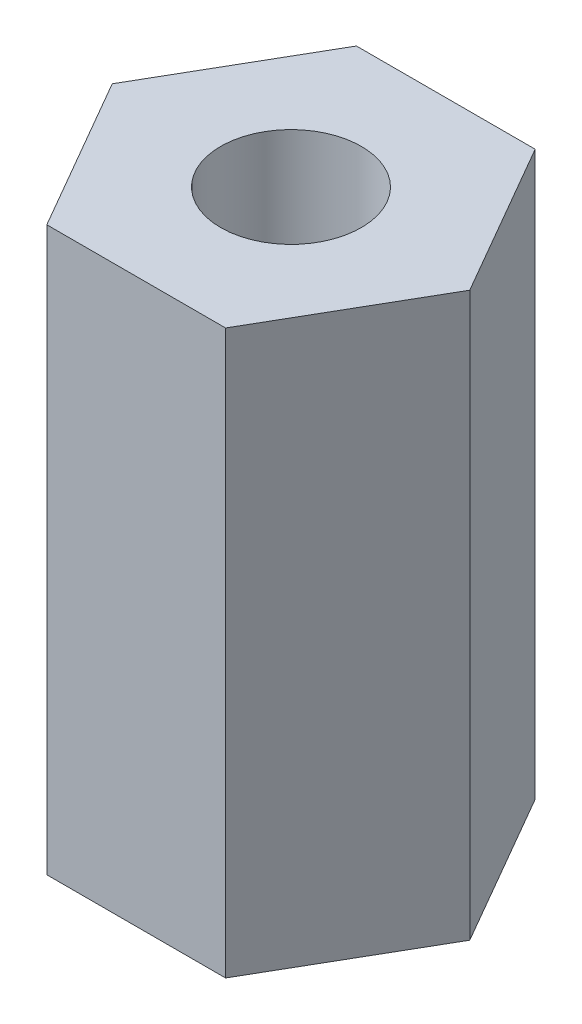
ISO-10303-21;
HEADER;
FILE_DESCRIPTION(('STEP AP214'),'2;1');
FILE_NAME('part.step','',(''),(''),'','','');
FILE_SCHEMA(('AUTOMOTIVE_DESIGN { 1 0 10303 214 1 1 1 1 }'));
ENDSEC;
DATA;
#1=APPLICATION_CONTEXT('core data for automotive mechanical design processes');
#2=APPLICATION_PROTOCOL_DEFINITION('international standard','automotive_design',2000,#1);
#3=PRODUCT_CONTEXT('',#1,'mechanical');
#4=PRODUCT('Part','Part','',(#3));
#5=PRODUCT_RELATED_PRODUCT_CATEGORY('part','',(#4));
#6=PRODUCT_DEFINITION_FORMATION('','',#4);
#7=PRODUCT_DEFINITION_CONTEXT('part definition',#1,'design');
#8=PRODUCT_DEFINITION('design','',#6,#7);
#9=PRODUCT_DEFINITION_SHAPE('','',#8);
#10=(LENGTH_UNIT() NAMED_UNIT(*) SI_UNIT(.MILLI.,.METRE.));
#11=(NAMED_UNIT(*) PLANE_ANGLE_UNIT() SI_UNIT($,.RADIAN.));
#12=(NAMED_UNIT(*) SI_UNIT($,.STERADIAN.) SOLID_ANGLE_UNIT());
#13=UNCERTAINTY_MEASURE_WITH_UNIT(LENGTH_MEASURE(1.E-05),#10,'distance_accuracy_value','');
#14=(GEOMETRIC_REPRESENTATION_CONTEXT(3) GLOBAL_UNCERTAINTY_ASSIGNED_CONTEXT((#13)) GLOBAL_UNIT_ASSIGNED_CONTEXT((#10,
#11,#12)) REPRESENTATION_CONTEXT('',''));
#15=CARTESIAN_POINT('',(0.,0.,0.));
#16=DIRECTION('',(0.,0.,1.));
#17=DIRECTION('',(1.,0.,0.));
#18=AXIS2_PLACEMENT_3D('',#15,#16,#17);
#19=CARTESIAN_POINT('',(0.,10.,0.));
#20=DIRECTION('',(0.,1.,0.));
#21=DIRECTION('',(0.,0.,1.));
#22=AXIS2_PLACEMENT_3D('',#19,#20,#21);
#23=PLANE('',#22);
#24=DIRECTION('',(0.5,0.,-0.866025403784439));
#25=VECTOR('',#24,1.);
#26=CARTESIAN_POINT('',(1.58771324027147,10.,2.75));
#27=LINE('',#26,#25);
#28=CARTESIAN_POINT('',(1.58771324027147,10.,2.75));
#29=VERTEX_POINT('',#28);
#30=CARTESIAN_POINT('',(3.17542648054294,10.,0.));
#31=VERTEX_POINT('',#30);
#32=EDGE_CURVE('E129',#29,#31,#27,.T.);
#33=ORIENTED_EDGE('',*,*,#32,.T.);
#34=DIRECTION('',(-0.5,0.,-0.866025403784438));
#35=VECTOR('',#34,1.);
#36=CARTESIAN_POINT('',(3.17542648054294,10.,0.));
#37=LINE('',#36,#35);
#38=CARTESIAN_POINT('',(1.58771324027147,10.,-2.75000000000001));
#39=VERTEX_POINT('',#38);
#40=EDGE_CURVE('E87',#31,#39,#37,.T.);
#41=ORIENTED_EDGE('',*,*,#40,.T.);
#42=DIRECTION('',(-1.,0.,0.));
#43=VECTOR('',#42,1.);
#44=CARTESIAN_POINT('',(1.58771324027147,10.,-2.75000000000001));
#45=LINE('',#44,#43);
#46=CARTESIAN_POINT('',(-1.58771324027147,10.,-2.75000000000001));
#47=VERTEX_POINT('',#46);
#48=EDGE_CURVE('E100',#39,#47,#45,.T.);
#49=ORIENTED_EDGE('',*,*,#48,.T.);
#50=DIRECTION('',(-0.5,0.,0.866025403784439));
#51=VECTOR('',#50,1.);
#52=CARTESIAN_POINT('',(-1.58771324027147,10.,-2.75000000000001));
#53=LINE('',#52,#51);
#54=CARTESIAN_POINT('',(-3.17542648054295,10.,0.));
#55=VERTEX_POINT('',#54);
#56=EDGE_CURVE('E94',#47,#55,#53,.T.);
#57=ORIENTED_EDGE('',*,*,#56,.T.);
#58=DIRECTION('',(0.5,0.,0.866025403784439));
#59=VECTOR('',#58,1.);
#60=CARTESIAN_POINT('',(-3.17542648054295,10.,0.));
#61=LINE('',#60,#59);
#62=CARTESIAN_POINT('',(-1.58771324027147,10.,2.75));
#63=VERTEX_POINT('',#62);
#64=EDGE_CURVE('E98',#55,#63,#61,.T.);
#65=ORIENTED_EDGE('',*,*,#64,.T.);
#66=DIRECTION('',(1.,0.,0.));
#67=VECTOR('',#66,1.);
#68=CARTESIAN_POINT('',(-1.58771324027147,10.,2.75));
#69=LINE('',#68,#67);
#70=EDGE_CURVE('E50',#63,#29,#69,.T.);
#71=ORIENTED_EDGE('',*,*,#70,.T.);
#72=EDGE_LOOP('',(#33,#41,#49,#57,#65,#71));
#73=FACE_BOUND('',#72,.T.);
#74=CARTESIAN_POINT('',(0.,10.,0.));
#75=DIRECTION('',(0.,1.,0.));
#76=DIRECTION('',(0.,0.,1.));
#77=AXIS2_PLACEMENT_3D('',#74,#75,#76);
#78=CIRCLE('',#77,1.25);
#79=CARTESIAN_POINT('',(0.,10.,1.25));
#80=VERTEX_POINT('',#79);
#81=EDGE_CURVE('E122',#80,#80,#78,.T.);
#82=ORIENTED_EDGE('',*,*,#81,.F.);
#83=EDGE_LOOP('',(#82));
#84=FACE_BOUND('',#83,.T.);
#85=ADVANCED_FACE('F33',(#73,#84),#23,.T.);
#86=CARTESIAN_POINT('',(0.,0.,0.));
#87=DIRECTION('',(0.,1.,0.));
#88=DIRECTION('',(0.,0.,1.));
#89=AXIS2_PLACEMENT_3D('',#86,#87,#88);
#90=PLANE('',#89);
#91=DIRECTION('',(0.5,0.,-0.866025403784439));
#92=VECTOR('',#91,1.);
#93=CARTESIAN_POINT('',(1.58771324027147,0.,2.75));
#94=LINE('',#93,#92);
#95=CARTESIAN_POINT('',(1.58771324027147,0.,2.75));
#96=VERTEX_POINT('',#95);
#97=CARTESIAN_POINT('',(3.17542648054294,0.,0.));
#98=VERTEX_POINT('',#97);
#99=EDGE_CURVE('E118',#96,#98,#94,.T.);
#100=ORIENTED_EDGE('',*,*,#99,.F.);
#101=DIRECTION('',(1.,0.,0.));
#102=VECTOR('',#101,1.);
#103=CARTESIAN_POINT('',(-1.58771324027147,0.,2.75));
#104=LINE('',#103,#102);
#105=CARTESIAN_POINT('',(-1.58771324027147,0.,2.75));
#106=VERTEX_POINT('',#105);
#107=EDGE_CURVE('E79',#106,#96,#104,.T.);
#108=ORIENTED_EDGE('',*,*,#107,.F.);
#109=DIRECTION('',(0.5,0.,0.866025403784439));
#110=VECTOR('',#109,1.);
#111=CARTESIAN_POINT('',(-3.17542648054295,0.,0.));
#112=LINE('',#111,#110);
#113=CARTESIAN_POINT('',(-3.17542648054295,0.,0.));
#114=VERTEX_POINT('',#113);
#115=EDGE_CURVE('E73',#114,#106,#112,.T.);
#116=ORIENTED_EDGE('',*,*,#115,.F.);
#117=DIRECTION('',(-0.5,0.,0.866025403784439));
#118=VECTOR('',#117,1.);
#119=CARTESIAN_POINT('',(-1.58771324027147,0.,-2.75000000000001));
#120=LINE('',#119,#118);
#121=CARTESIAN_POINT('',(-1.58771324027147,0.,-2.75000000000001));
#122=VERTEX_POINT('',#121);
#123=EDGE_CURVE('E108',#122,#114,#120,.T.);
#124=ORIENTED_EDGE('',*,*,#123,.F.);
#125=DIRECTION('',(-1.,0.,0.));
#126=VECTOR('',#125,1.);
#127=CARTESIAN_POINT('',(1.58771324027147,0.,-2.75000000000001));
#128=LINE('',#127,#126);
#129=CARTESIAN_POINT('',(1.58771324027147,0.,-2.75000000000001));
#130=VERTEX_POINT('',#129);
#131=EDGE_CURVE('E124',#130,#122,#128,.T.);
#132=ORIENTED_EDGE('',*,*,#131,.F.);
#133=DIRECTION('',(-0.5,0.,-0.866025403784438));
#134=VECTOR('',#133,1.);
#135=CARTESIAN_POINT('',(3.17542648054294,0.,0.));
#136=LINE('',#135,#134);
#137=EDGE_CURVE('E121',#98,#130,#136,.T.);
#138=ORIENTED_EDGE('',*,*,#137,.F.);
#139=EDGE_LOOP('',(#100,#108,#116,#124,#132,#138));
#140=FACE_BOUND('',#139,.T.);
#141=CARTESIAN_POINT('',(0.,0.,0.));
#142=DIRECTION('',(0.,1.,0.));
#143=DIRECTION('',(0.,0.,1.));
#144=AXIS2_PLACEMENT_3D('',#141,#142,#143);
#145=CIRCLE('',#144,1.25);
#146=CARTESIAN_POINT('',(0.,0.,1.25));
#147=VERTEX_POINT('',#146);
#148=EDGE_CURVE('E222',#147,#147,#145,.T.);
#149=ORIENTED_EDGE('',*,*,#148,.T.);
#150=EDGE_LOOP('',(#149));
#151=FACE_BOUND('',#150,.T.);
#152=ADVANCED_FACE('F138',(#140,#151),#90,.F.);
#153=CARTESIAN_POINT('',(1.58771324027147,10.,2.75));
#154=DIRECTION('',(-0.866025403784439,0.,-0.5));
#155=DIRECTION('',(-0.5,0.,0.866025403784439));
#156=AXIS2_PLACEMENT_3D('',#153,#154,#155);
#157=PLANE('',#156);
#158=ORIENTED_EDGE('',*,*,#99,.T.);
#159=DIRECTION('',(0.,-1.,0.));
#160=VECTOR('',#159,1.);
#161=CARTESIAN_POINT('',(3.17542648054294,10.,0.));
#162=LINE('',#161,#160);
#163=EDGE_CURVE('E11',#31,#98,#162,.T.);
#164=ORIENTED_EDGE('',*,*,#163,.F.);
#165=ORIENTED_EDGE('',*,*,#32,.F.);
#166=DIRECTION('',(0.,-1.,0.));
#167=VECTOR('',#166,1.);
#168=CARTESIAN_POINT('',(1.58771324027147,10.,2.75));
#169=LINE('',#168,#167);
#170=EDGE_CURVE('E114',#29,#96,#169,.T.);
#171=ORIENTED_EDGE('',*,*,#170,.T.);
#172=EDGE_LOOP('',(#158,#164,#165,#171));
#173=FACE_BOUND('',#172,.T.);
#174=ADVANCED_FACE('F35',(#173),#157,.F.);
#175=CARTESIAN_POINT('',(3.17542648054294,10.,0.));
#176=DIRECTION('',(-0.866025403784438,0.,0.5));
#177=DIRECTION('',(0.5,0.,0.866025403784439));
#178=AXIS2_PLACEMENT_3D('',#175,#176,#177);
#179=PLANE('',#178);
#180=ORIENTED_EDGE('',*,*,#137,.T.);
#181=DIRECTION('',(0.,-1.,0.));
#182=VECTOR('',#181,1.);
#183=CARTESIAN_POINT('',(1.58771324027147,10.,-2.75000000000001));
#184=LINE('',#183,#182);
#185=EDGE_CURVE('E42',#39,#130,#184,.T.);
#186=ORIENTED_EDGE('',*,*,#185,.F.);
#187=ORIENTED_EDGE('',*,*,#40,.F.);
#188=ORIENTED_EDGE('',*,*,#163,.T.);
#189=EDGE_LOOP('',(#180,#186,#187,#188));
#190=FACE_BOUND('',#189,.T.);
#191=ADVANCED_FACE('F163',(#190),#179,.F.);
#192=CARTESIAN_POINT('',(1.58771324027147,10.,-2.75000000000001));
#193=DIRECTION('',(0.,0.,1.));
#194=DIRECTION('',(1.,0.,0.));
#195=AXIS2_PLACEMENT_3D('',#192,#193,#194);
#196=PLANE('',#195);
#197=ORIENTED_EDGE('',*,*,#131,.T.);
#198=DIRECTION('',(0.,-1.,0.));
#199=VECTOR('',#198,1.);
#200=CARTESIAN_POINT('',(-1.58771324027147,10.,-2.75000000000001));
#201=LINE('',#200,#199);
#202=EDGE_CURVE('E109',#47,#122,#201,.T.);
#203=ORIENTED_EDGE('',*,*,#202,.F.);
#204=ORIENTED_EDGE('',*,*,#48,.F.);
#205=ORIENTED_EDGE('',*,*,#185,.T.);
#206=EDGE_LOOP('',(#197,#203,#204,#205));
#207=FACE_BOUND('',#206,.T.);
#208=ADVANCED_FACE('F135',(#207),#196,.F.);
#209=CARTESIAN_POINT('',(-1.58771324027147,10.,-2.75000000000001));
#210=DIRECTION('',(0.866025403784439,0.,0.5));
#211=DIRECTION('',(0.5,0.,-0.866025403784439));
#212=AXIS2_PLACEMENT_3D('',#209,#210,#211);
#213=PLANE('',#212);
#214=ORIENTED_EDGE('',*,*,#123,.T.);
#215=DIRECTION('',(0.,-1.,0.));
#216=VECTOR('',#215,1.);
#217=CARTESIAN_POINT('',(-3.17542648054295,10.,0.));
#218=LINE('',#217,#216);
#219=EDGE_CURVE('E105',#55,#114,#218,.T.);
#220=ORIENTED_EDGE('',*,*,#219,.F.);
#221=ORIENTED_EDGE('',*,*,#56,.F.);
#222=ORIENTED_EDGE('',*,*,#202,.T.);
#223=EDGE_LOOP('',(#214,#220,#221,#222));
#224=FACE_BOUND('',#223,.T.);
#225=ADVANCED_FACE('F106',(#224),#213,.F.);
#226=CARTESIAN_POINT('',(-3.17542648054295,10.,0.));
#227=DIRECTION('',(0.866025403784439,0.,-0.5));
#228=DIRECTION('',(-0.5,0.,-0.866025403784439));
#229=AXIS2_PLACEMENT_3D('',#226,#227,#228);
#230=PLANE('',#229);
#231=ORIENTED_EDGE('',*,*,#115,.T.);
#232=DIRECTION('',(0.,-1.,0.));
#233=VECTOR('',#232,1.);
#234=CARTESIAN_POINT('',(-1.58771324027147,10.,2.75));
#235=LINE('',#234,#233);
#236=EDGE_CURVE('E110',#63,#106,#235,.T.);
#237=ORIENTED_EDGE('',*,*,#236,.F.);
#238=ORIENTED_EDGE('',*,*,#64,.F.);
#239=ORIENTED_EDGE('',*,*,#219,.T.);
#240=EDGE_LOOP('',(#231,#237,#238,#239));
#241=FACE_BOUND('',#240,.T.);
#242=ADVANCED_FACE('F112',(#241),#230,.F.);
#243=CARTESIAN_POINT('',(-1.58771324027147,10.,2.75));
#244=DIRECTION('',(0.,0.,-1.));
#245=DIRECTION('',(-1.,0.,0.));
#246=AXIS2_PLACEMENT_3D('',#243,#244,#245);
#247=PLANE('',#246);
#248=ORIENTED_EDGE('',*,*,#107,.T.);
#249=ORIENTED_EDGE('',*,*,#170,.F.);
#250=ORIENTED_EDGE('',*,*,#70,.F.);
#251=ORIENTED_EDGE('',*,*,#236,.T.);
#252=EDGE_LOOP('',(#248,#249,#250,#251));
#253=FACE_BOUND('',#252,.T.);
#254=ADVANCED_FACE('F143',(#253),#247,.F.);
#255=CARTESIAN_POINT('',(0.,10.,0.));
#256=DIRECTION('',(0.,-1.,0.));
#257=DIRECTION('',(0.,0.,-1.));
#258=AXIS2_PLACEMENT_3D('',#255,#256,#257);
#259=CYLINDRICAL_SURFACE('',#258,1.25);
#260=ORIENTED_EDGE('',*,*,#81,.T.);
#261=EDGE_LOOP('',(#260));
#262=FACE_BOUND('',#261,.T.);
#263=ORIENTED_EDGE('',*,*,#148,.F.);
#264=EDGE_LOOP('',(#263));
#265=FACE_BOUND('',#264,.T.);
#266=ADVANCED_FACE('F145',(#262,#265),#259,.F.);
#267=CLOSED_SHELL('',(#85,#152,#174,#191,#208,#225,#242,#254,#266));
#268=MANIFOLD_SOLID_BREP('B2',#267);
#269=ADVANCED_BREP_SHAPE_REPRESENTATION('',(#18,#268),#14);
#270=SHAPE_DEFINITION_REPRESENTATION(#9,#269);
ENDSEC;
END-ISO-10303-21;
